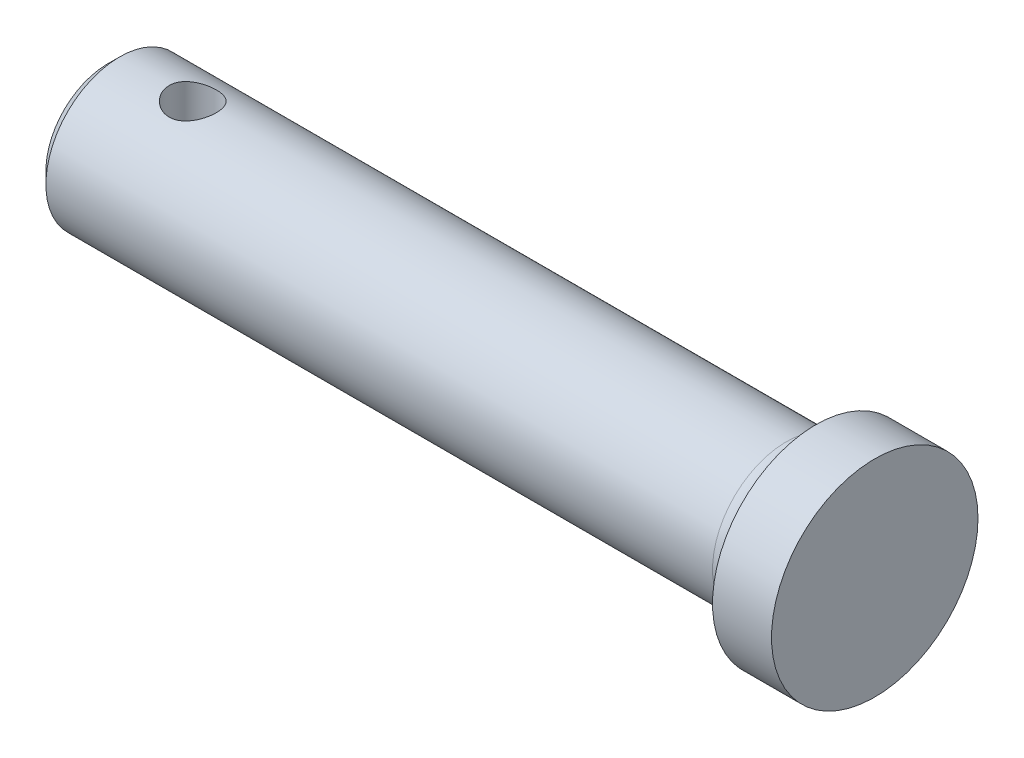
ISO-10303-21;
HEADER;
FILE_DESCRIPTION(('STEP AP214'),'2;1');
FILE_NAME('part.step','',(''),(''),'','','');
FILE_SCHEMA(('AUTOMOTIVE_DESIGN { 1 0 10303 214 1 1 1 1 }'));
ENDSEC;
DATA;
#1=APPLICATION_CONTEXT('core data for automotive mechanical design processes');
#2=APPLICATION_PROTOCOL_DEFINITION('international standard','automotive_design',2000,#1);
#3=PRODUCT_CONTEXT('',#1,'mechanical');
#4=PRODUCT('Part','Part','',(#3));
#5=PRODUCT_RELATED_PRODUCT_CATEGORY('part','',(#4));
#6=PRODUCT_DEFINITION_FORMATION('','',#4);
#7=PRODUCT_DEFINITION_CONTEXT('part definition',#1,'design');
#8=PRODUCT_DEFINITION('design','',#6,#7);
#9=PRODUCT_DEFINITION_SHAPE('','',#8);
#10=(LENGTH_UNIT() NAMED_UNIT(*) SI_UNIT(.MILLI.,.METRE.));
#11=(NAMED_UNIT(*) PLANE_ANGLE_UNIT() SI_UNIT($,.RADIAN.));
#12=(NAMED_UNIT(*) SI_UNIT($,.STERADIAN.) SOLID_ANGLE_UNIT());
#13=UNCERTAINTY_MEASURE_WITH_UNIT(LENGTH_MEASURE(1.E-05),#10,'distance_accuracy_value','');
#14=(GEOMETRIC_REPRESENTATION_CONTEXT(3) GLOBAL_UNCERTAINTY_ASSIGNED_CONTEXT((#13)) GLOBAL_UNIT_ASSIGNED_CONTEXT((#10,
#11,#12)) REPRESENTATION_CONTEXT('',''));
#15=CARTESIAN_POINT('',(0.,0.,0.));
#16=DIRECTION('',(0.,0.,1.));
#17=DIRECTION('',(1.,0.,0.));
#18=AXIS2_PLACEMENT_3D('',#15,#16,#17);
#19=CARTESIAN_POINT('',(12.,0.,0.));
#20=DIRECTION('',(-1.,0.,0.));
#21=DIRECTION('',(0.,0.,1.));
#22=AXIS2_PLACEMENT_3D('',#19,#20,#21);
#23=CYLINDRICAL_SURFACE('',#22,1.25);
#24=CARTESIAN_POINT('',(0.199999999999999,0.,0.));
#25=DIRECTION('',(1.,0.,0.));
#26=DIRECTION('',(0.,0.,-1.));
#27=AXIS2_PLACEMENT_3D('',#24,#25,#26);
#28=CIRCLE('',#27,1.25);
#29=CARTESIAN_POINT('',(0.199999999999999,0.,-1.25));
#30=VERTEX_POINT('',#29);
#31=EDGE_CURVE('E44',#30,#30,#28,.T.);
#32=ORIENTED_EDGE('',*,*,#31,.T.);
#33=EDGE_LOOP('',(#32));
#34=FACE_BOUND('',#33,.T.);
#35=CARTESIAN_POINT('',(1.44,-1.1842719282327,0.400000000000002));
#36=CARTESIAN_POINT('',(1.46184155948885,-1.18427199705065,0.399999935935952));
#37=CARTESIAN_POINT('',(1.48368387591803,-1.18488277435335,0.398204982921457));
#38=CARTESIAN_POINT('',(1.52672489688686,-1.18724843012857,0.391094422936348));
#39=CARTESIAN_POINT('',(1.54792345091376,-1.18900357403315,0.385777999167627));
#40=CARTESIAN_POINT('',(1.58904702541662,-1.19343925355512,0.37182755470459));
#41=CARTESIAN_POINT('',(1.60897430632724,-1.1961180891577,0.36319962541681));
#42=CARTESIAN_POINT('',(1.64710441025378,-1.20209691390213,0.342891586136491));
#43=CARTESIAN_POINT('',(1.6653069000917,-1.2053970226891,0.331210888071483));
#44=CARTESIAN_POINT('',(1.70012659878342,-1.21237992190423,0.304678104882738));
#45=CARTESIAN_POINT('',(1.71667254136882,-1.21607169507431,0.289734836823264));
#46=CARTESIAN_POINT('',(1.74707160646584,-1.22334570053617,0.25729603058258));
#47=CARTESIAN_POINT('',(1.76092433365551,-1.22692791668176,0.239800118371838));
#48=CARTESIAN_POINT('',(1.78586134632503,-1.23368238271334,0.202237355615685));
#49=CARTESIAN_POINT('',(1.79687178732732,-1.23684282786163,0.182119171965247));
#50=CARTESIAN_POINT('',(1.8153246409914,-1.24229242661382,0.140198048377141));
#51=CARTESIAN_POINT('',(1.82276793544067,-1.24458179551617,0.118395526351673));
#52=CARTESIAN_POINT('',(1.83363594480709,-1.24796769503786,0.0744711775297697));
#53=CARTESIAN_POINT('',(1.8371825644154,-1.24910032748544,0.052382347218549));
#54=CARTESIAN_POINT('',(1.84054327637528,-1.25017287029849,0.00789603248012458));
#55=CARTESIAN_POINT('',(1.84035825720045,-1.25011306457407,-0.0145013772077105));
#56=CARTESIAN_POINT('',(1.83634012450691,-1.24883236997898,-0.0581093729167385));
#57=CARTESIAN_POINT('',(1.83263925053984,-1.24765357034492,-0.0793335790758808));
#58=CARTESIAN_POINT('',(1.82191204418971,-1.24431948493381,-0.120842073412406));
#59=CARTESIAN_POINT('',(1.81488549158602,-1.24216413449167,-0.141126299248263));
#60=CARTESIAN_POINT('',(1.79762419187054,-1.23706365500521,-0.18047848740372));
#61=CARTESIAN_POINT('',(1.78735020460161,-1.23410893332627,-0.199527942968374));
#62=CARTESIAN_POINT('',(1.76391744827536,-1.22771970855094,-0.235672859352784));
#63=CARTESIAN_POINT('',(1.75075792313235,-1.22428507979218,-0.252767806251125));
#64=CARTESIAN_POINT('',(1.7212530895667,-1.2171236729529,-0.285306381310878));
#65=CARTESIAN_POINT('',(1.70479390923559,-1.21339068620886,-0.300645534450353));
#66=CARTESIAN_POINT('',(1.66950293475513,-1.20618145987784,-0.328378018395144));
#67=CARTESIAN_POINT('',(1.65067083261125,-1.20270525371291,-0.340770966192465));
#68=CARTESIAN_POINT('',(1.61086081492657,-1.19637089346056,-0.362388810956359));
#69=CARTESIAN_POINT('',(1.58985948115577,-1.19352081463549,-0.371573126098638));
#70=CARTESIAN_POINT('',(1.54649479840236,-1.18885562868785,-0.386241154381988));
#71=CARTESIAN_POINT('',(1.52413197070376,-1.1870401281737,-0.391726274263441));
#72=CARTESIAN_POINT('',(1.4796840224799,-1.1847375795604,-0.398634732977718));
#73=CARTESIAN_POINT('',(1.45762658792155,-1.18419801132839,-0.40021876938558));
#74=CARTESIAN_POINT('',(1.41355893236589,-1.18436224738472,-0.399732669767853));
#75=CARTESIAN_POINT('',(1.39154870422493,-1.18506584796445,-0.39766313242562));
#76=CARTESIAN_POINT('',(1.34890574316186,-1.18758511024498,-0.390072533361582));
#77=CARTESIAN_POINT('',(1.32825146332475,-1.18936586120205,-0.384659716428387));
#78=CARTESIAN_POINT('',(1.28814721006557,-1.19380128773476,-0.370664280725205));
#79=CARTESIAN_POINT('',(1.26869743990753,-1.1964561103373,-0.362081128645974));
#80=CARTESIAN_POINT('',(1.23091303820939,-1.20243860590778,-0.341697396012559));
#81=CARTESIAN_POINT('',(1.21262886029763,-1.20578396098416,-0.329808617389166));
#82=CARTESIAN_POINT('',(1.17825664445409,-1.2127347983344,-0.303252999413203));
#83=CARTESIAN_POINT('',(1.16216920649793,-1.21634035126439,-0.288585403708637));
#84=CARTESIAN_POINT('',(1.13192022234144,-1.22359628130632,-0.256125244512293));
#85=CARTESIAN_POINT('',(1.11787379960407,-1.22724171226698,-0.238223997872509));
#86=CARTESIAN_POINT('',(1.09297873068082,-1.23400966382322,-0.200229721221567));
#87=CARTESIAN_POINT('',(1.08212994796963,-1.23713220674139,-0.180136784836228));
#88=CARTESIAN_POINT('',(1.06404100068307,-1.24248572290487,-0.138445940226064));
#89=CARTESIAN_POINT('',(1.05677547039656,-1.24472294035215,-0.116859881389166));
#90=CARTESIAN_POINT('',(1.04600397397232,-1.24808106165771,-0.0726874957062997));
#91=CARTESIAN_POINT('',(1.04249676816827,-1.24920233359687,-0.0501015012458257));
#92=CARTESIAN_POINT('',(1.03944607302506,-1.25017663129826,-0.00562765879062506));
#93=CARTESIAN_POINT('',(1.03973667124253,-1.25008274477245,0.016247776123611));
#94=CARTESIAN_POINT('',(1.04386927119456,-1.24876568899275,0.0596238594775709));
#95=CARTESIAN_POINT('',(1.04771102195009,-1.2475425995457,0.081124534294193));
#96=CARTESIAN_POINT('',(1.05872956769149,-1.24412233539437,0.122850760398066));
#97=CARTESIAN_POINT('',(1.06586009311142,-1.24193869374862,0.143089717143293));
#98=CARTESIAN_POINT('',(1.08321165239307,-1.23682230993072,0.182093134276042));
#99=CARTESIAN_POINT('',(1.09343322795864,-1.23388943647033,0.200857335487156));
#100=CARTESIAN_POINT('',(1.11709027694636,-1.22745138549402,0.237094464163672));
#101=CARTESIAN_POINT('',(1.13062580905115,-1.22392975634581,0.254499113183194));
#102=CARTESIAN_POINT('',(1.16035231896004,-1.21675595998011,0.286844801950647));
#103=CARTESIAN_POINT('',(1.17654410992333,-1.21310375305752,0.301785084465705));
#104=CARTESIAN_POINT('',(1.21180666140923,-1.20592883124558,0.329310491309836));
#105=CARTESIAN_POINT('',(1.23095875051859,-1.20241521108021,0.341794102245843));
#106=CARTESIAN_POINT('',(1.27119617641749,-1.19607741955207,0.363353471704927));
#107=CARTESIAN_POINT('',(1.29228082275794,-1.19325300326645,0.372430441467136));
#108=CARTESIAN_POINT('',(1.33424571027844,-1.18881467077541,0.386354015966545));
#109=CARTESIAN_POINT('',(1.35503378897818,-1.18712893466933,0.391455627648995));
#110=CARTESIAN_POINT('',(1.39721444971404,-1.18485768284986,0.398278180436229));
#111=CARTESIAN_POINT('',(1.4186068617678,-1.18427186082763,0.400000062748775));
#112=CARTESIAN_POINT('',(1.44,-1.1842719282327,0.400000000000002));
#113=B_SPLINE_CURVE_WITH_KNOTS('',3,(#35,#36,#37,#38,#39,#40,#41,#42,#43,#44,#45,#46,#47,#48,
#49,#50,#51,#52,#53,#54,#55,#56,#57,#58,#59,#60,#61,#62,#63,#64,#65,#66,#67,#68,#69,#70,#71,#72,
#73,#74,#75,#76,#77,#78,#79,#80,#81,#82,#83,#84,#85,#86,#87,#88,#89,#90,#91,#92,#93,#94,#95,#96,
#97,#98,#99,#100,#101,#102,#103,#104,#105,#106,#107,#108,#109,#110,#111,#112),.UNSPECIFIED.,.T.,
.F.,(4,2,2,2,2,2,2,2,2,2,2,2,2,2,2,2,2,2,2,2,2,2,2,2,2,2,2,2,2,2,2,2,2,2,2,2,2,2,4),(0.,
0.0654455842618314,0.130906353814331,0.196247283079579,0.26160080863461,0.329090543023647,
0.396590176384582,0.465698443708911,0.534789618862443,0.601651686030156,0.668497834057723,
0.732925318488274,0.797357069791251,0.862599225170845,0.92785849615777,0.995962670791873,
1.06407569416318,1.13302140452565,1.20194088121282,1.26796997830033,1.33398825670589,
1.39797364081714,1.46196979336382,1.52787163318736,1.59379143633313,1.66259668092843,
1.73139898741332,1.79970699217212,1.86799245890297,1.93330513200712,1.99861318946651,
2.06302921464941,2.12745653523327,2.19414122838632,2.26084637391653,2.32990150248183,
2.39893205502387,2.46305185838162,2.52715380272838),.UNSPECIFIED.);
#114=CARTESIAN_POINT('',(1.44,-1.1842719282327,0.400000000000002));
#115=VERTEX_POINT('',#114);
#116=EDGE_CURVE('E57',#115,#115,#113,.T.);
#117=ORIENTED_EDGE('',*,*,#116,.T.);
#118=EDGE_LOOP('',(#117));
#119=FACE_BOUND('',#118,.T.);
#120=CARTESIAN_POINT('',(1.44,1.1842719282327,0.400000000000002));
#121=CARTESIAN_POINT('',(1.41815844051115,1.18427199705065,0.399999935935952));
#122=CARTESIAN_POINT('',(1.39631612408197,1.18488277435335,0.398204982921457));
#123=CARTESIAN_POINT('',(1.35327510311314,1.18724843012857,0.391094422936348));
#124=CARTESIAN_POINT('',(1.33207654908623,1.18900357403315,0.385777999167627));
#125=CARTESIAN_POINT('',(1.29095297458338,1.19343925355512,0.37182755470459));
#126=CARTESIAN_POINT('',(1.27102569367276,1.1961180891577,0.36319962541681));
#127=CARTESIAN_POINT('',(1.23289558974622,1.20209691390213,0.342891586136491));
#128=CARTESIAN_POINT('',(1.2146930999083,1.2053970226891,0.331210888071483));
#129=CARTESIAN_POINT('',(1.17987340121658,1.21237992190423,0.304678104882738));
#130=CARTESIAN_POINT('',(1.16332745863118,1.21607169507431,0.289734836823264));
#131=CARTESIAN_POINT('',(1.13292839353416,1.22334570053617,0.25729603058258));
#132=CARTESIAN_POINT('',(1.11907566634449,1.22692791668176,0.239800118371838));
#133=CARTESIAN_POINT('',(1.09413865367496,1.23368238271334,0.202237355615685));
#134=CARTESIAN_POINT('',(1.08312821267268,1.23684282786163,0.182119171965247));
#135=CARTESIAN_POINT('',(1.0646753590086,1.24229242661382,0.140198048377141));
#136=CARTESIAN_POINT('',(1.05723206455933,1.24458179551617,0.118395526351673));
#137=CARTESIAN_POINT('',(1.04636405519291,1.24796769503786,0.0744711775297697));
#138=CARTESIAN_POINT('',(1.0428174355846,1.24910032748544,0.052382347218549));
#139=CARTESIAN_POINT('',(1.03945672362472,1.25017287029849,0.00789603248012461));
#140=CARTESIAN_POINT('',(1.03964174279955,1.25011306457407,-0.0145013772077105));
#141=CARTESIAN_POINT('',(1.04365987549309,1.24883236997898,-0.0581093729167385));
#142=CARTESIAN_POINT('',(1.04736074946015,1.24765357034492,-0.0793335790758808));
#143=CARTESIAN_POINT('',(1.05808795581029,1.24431948493381,-0.120842073412406));
#144=CARTESIAN_POINT('',(1.06511450841398,1.24216413449167,-0.141126299248263));
#145=CARTESIAN_POINT('',(1.08237580812945,1.23706365500521,-0.18047848740372));
#146=CARTESIAN_POINT('',(1.09264979539839,1.23410893332627,-0.199527942968374));
#147=CARTESIAN_POINT('',(1.11608255172464,1.22771970855094,-0.235672859352784));
#148=CARTESIAN_POINT('',(1.12924207686765,1.22428507979218,-0.252767806251125));
#149=CARTESIAN_POINT('',(1.1587469104333,1.2171236729529,-0.285306381310878));
#150=CARTESIAN_POINT('',(1.17520609076441,1.21339068620886,-0.300645534450353));
#151=CARTESIAN_POINT('',(1.21049706524487,1.20618145987784,-0.328378018395144));
#152=CARTESIAN_POINT('',(1.22932916738875,1.20270525371291,-0.340770966192465));
#153=CARTESIAN_POINT('',(1.26913918507343,1.19637089346056,-0.362388810956359));
#154=CARTESIAN_POINT('',(1.29014051884423,1.19352081463549,-0.371573126098638));
#155=CARTESIAN_POINT('',(1.33350520159764,1.18885562868785,-0.386241154381988));
#156=CARTESIAN_POINT('',(1.35586802929623,1.1870401281737,-0.391726274263441));
#157=CARTESIAN_POINT('',(1.4003159775201,1.1847375795604,-0.398634732977718));
#158=CARTESIAN_POINT('',(1.42237341207845,1.18419801132839,-0.40021876938558));
#159=CARTESIAN_POINT('',(1.46644106763411,1.18436224738472,-0.399732669767853));
#160=CARTESIAN_POINT('',(1.48845129577507,1.18506584796445,-0.39766313242562));
#161=CARTESIAN_POINT('',(1.53109425683814,1.18758511024498,-0.390072533361582));
#162=CARTESIAN_POINT('',(1.55174853667525,1.18936586120205,-0.384659716428387));
#163=CARTESIAN_POINT('',(1.59185278993443,1.19380128773476,-0.370664280725205));
#164=CARTESIAN_POINT('',(1.61130256009247,1.1964561103373,-0.362081128645974));
#165=CARTESIAN_POINT('',(1.6490869617906,1.20243860590778,-0.341697396012559));
#166=CARTESIAN_POINT('',(1.66737113970237,1.20578396098416,-0.329808617389166));
#167=CARTESIAN_POINT('',(1.7017433555459,1.2127347983344,-0.303252999413203));
#168=CARTESIAN_POINT('',(1.71783079350207,1.21634035126439,-0.288585403708637));
#169=CARTESIAN_POINT('',(1.74807977765856,1.22359628130632,-0.256125244512293));
#170=CARTESIAN_POINT('',(1.76212620039593,1.22724171226698,-0.238223997872509));
#171=CARTESIAN_POINT('',(1.78702126931918,1.23400966382322,-0.200229721221567));
#172=CARTESIAN_POINT('',(1.79787005203037,1.23713220674139,-0.180136784836228));
#173=CARTESIAN_POINT('',(1.81595899931693,1.24248572290487,-0.138445940226064));
#174=CARTESIAN_POINT('',(1.82322452960344,1.24472294035215,-0.116859881389166));
#175=CARTESIAN_POINT('',(1.83399602602768,1.24808106165771,-0.0726874957062997));
#176=CARTESIAN_POINT('',(1.83750323183173,1.24920233359687,-0.0501015012458257));
#177=CARTESIAN_POINT('',(1.84055392697494,1.25017663129826,-0.00562765879062506));
#178=CARTESIAN_POINT('',(1.84026332875747,1.25008274477245,0.016247776123611));
#179=CARTESIAN_POINT('',(1.83613072880544,1.24876568899275,0.0596238594775709));
#180=CARTESIAN_POINT('',(1.83228897804991,1.2475425995457,0.081124534294193));
#181=CARTESIAN_POINT('',(1.82127043230851,1.24412233539437,0.122850760398066));
#182=CARTESIAN_POINT('',(1.81413990688858,1.24193869374862,0.143089717143293));
#183=CARTESIAN_POINT('',(1.79678834760693,1.23682230993072,0.182093134276042));
#184=CARTESIAN_POINT('',(1.78656677204136,1.23388943647033,0.200857335487156));
#185=CARTESIAN_POINT('',(1.76290972305363,1.22745138549402,0.237094464163672));
#186=CARTESIAN_POINT('',(1.74937419094885,1.22392975634581,0.254499113183194));
#187=CARTESIAN_POINT('',(1.71964768103996,1.21675595998011,0.286844801950647));
#188=CARTESIAN_POINT('',(1.70345589007666,1.21310375305752,0.301785084465705));
#189=CARTESIAN_POINT('',(1.66819333859077,1.20592883124558,0.329310491309836));
#190=CARTESIAN_POINT('',(1.64904124948141,1.20241521108021,0.341794102245843));
#191=CARTESIAN_POINT('',(1.60880382358251,1.19607741955207,0.363353471704927));
#192=CARTESIAN_POINT('',(1.58771917724206,1.19325300326645,0.372430441467136));
#193=CARTESIAN_POINT('',(1.54575428972156,1.18881467077541,0.386354015966545));
#194=CARTESIAN_POINT('',(1.52496621102182,1.18712893466933,0.391455627648995));
#195=CARTESIAN_POINT('',(1.48278555028596,1.18485768284986,0.398278180436229));
#196=CARTESIAN_POINT('',(1.4613931382322,1.18427186082763,0.400000062748775));
#197=CARTESIAN_POINT('',(1.44,1.1842719282327,0.400000000000002));
#198=B_SPLINE_CURVE_WITH_KNOTS('',3,(#120,#121,#122,#123,#124,#125,#126,#127,#128,#129,#130,
#131,#132,#133,#134,#135,#136,#137,#138,#139,#140,#141,#142,#143,#144,#145,#146,#147,#148,#149,
#150,#151,#152,#153,#154,#155,#156,#157,#158,#159,#160,#161,#162,#163,#164,#165,#166,#167,#168,
#169,#170,#171,#172,#173,#174,#175,#176,#177,#178,#179,#180,#181,#182,#183,#184,#185,#186,#187,
#188,#189,#190,#191,#192,#193,#194,#195,#196,#197),.UNSPECIFIED.,.T.,.F.,(4,2,2,2,2,2,2,2,2,2,2,
2,2,2,2,2,2,2,2,2,2,2,2,2,2,2,2,2,2,2,2,2,2,2,2,2,2,2,4),(0.,0.0654455842618314,
0.130906353814331,0.196247283079579,0.26160080863461,0.329090543023647,0.396590176384582,
0.465698443708911,0.534789618862443,0.601651686030156,0.668497834057723,0.732925318488274,
0.797357069791251,0.862599225170845,0.92785849615777,0.995962670791873,1.06407569416318,
1.13302140452565,1.20194088121282,1.26796997830033,1.33398825670589,1.39797364081714,
1.46196979336382,1.52787163318736,1.59379143633313,1.66259668092843,1.73139898741332,
1.79970699217212,1.86799245890297,1.93330513200712,1.99861318946651,2.06302921464941,
2.12745653523327,2.19414122838632,2.26084637391653,2.32990150248183,2.39893205502387,
2.46305185838162,2.52715380272838),.UNSPECIFIED.);
#199=CARTESIAN_POINT('',(1.44,1.1842719282327,0.400000000000002));
#200=VERTEX_POINT('',#199);
#201=EDGE_CURVE('E67',#200,#200,#198,.T.);
#202=ORIENTED_EDGE('',*,*,#201,.T.);
#203=EDGE_LOOP('',(#202));
#204=FACE_BOUND('',#203,.T.);
#205=CARTESIAN_POINT('',(11.5,0.,0.));
#206=DIRECTION('',(1.,0.,0.));
#207=DIRECTION('',(0.,0.,-1.));
#208=AXIS2_PLACEMENT_3D('',#205,#206,#207);
#209=CIRCLE('',#208,1.25);
#210=CARTESIAN_POINT('',(11.5,0.,-1.25));
#211=VERTEX_POINT('',#210);
#212=EDGE_CURVE('E49',#211,#211,#209,.F.);
#213=ORIENTED_EDGE('',*,*,#212,.T.);
#214=EDGE_LOOP('',(#213));
#215=FACE_BOUND('',#214,.T.);
#216=ADVANCED_FACE('F36',(#34,#119,#204,#215),#23,.T.);
#217=CARTESIAN_POINT('',(0.,0.,0.));
#218=DIRECTION('',(1.,0.,0.));
#219=DIRECTION('',(0.,0.,-1.));
#220=AXIS2_PLACEMENT_3D('',#217,#218,#219);
#221=PLANE('',#220);
#222=CARTESIAN_POINT('',(0.,0.,0.));
#223=DIRECTION('',(1.,0.,0.));
#224=DIRECTION('',(0.,0.,-1.));
#225=AXIS2_PLACEMENT_3D('',#222,#223,#224);
#226=CIRCLE('',#225,1.05);
#227=CARTESIAN_POINT('',(0.,0.,-1.05));
#228=VERTEX_POINT('',#227);
#229=EDGE_CURVE('E10',#228,#228,#226,.F.);
#230=ORIENTED_EDGE('',*,*,#229,.T.);
#231=EDGE_LOOP('',(#230));
#232=FACE_BOUND('',#231,.T.);
#233=ADVANCED_FACE('F86',(#232),#221,.F.);
#234=CARTESIAN_POINT('',(13.,0.,0.));
#235=DIRECTION('',(-1.,0.,0.));
#236=DIRECTION('',(0.,0.,1.));
#237=AXIS2_PLACEMENT_3D('',#234,#235,#236);
#238=CYLINDRICAL_SURFACE('',#237,1.75);
#239=CARTESIAN_POINT('',(13.,0.,0.));
#240=DIRECTION('',(1.,0.,0.));
#241=DIRECTION('',(0.,0.,-1.));
#242=AXIS2_PLACEMENT_3D('',#239,#240,#241);
#243=CIRCLE('',#242,1.75);
#244=CARTESIAN_POINT('',(13.,0.,-1.75));
#245=VERTEX_POINT('',#244);
#246=EDGE_CURVE('E54',#245,#245,#243,.T.);
#247=ORIENTED_EDGE('',*,*,#246,.F.);
#248=EDGE_LOOP('',(#247));
#249=FACE_BOUND('',#248,.T.);
#250=CARTESIAN_POINT('',(12.,0.,0.));
#251=DIRECTION('',(1.,0.,0.));
#252=DIRECTION('',(0.,0.,-1.));
#253=AXIS2_PLACEMENT_3D('',#250,#251,#252);
#254=CIRCLE('',#253,1.75);
#255=CARTESIAN_POINT('',(12.,0.,-1.75));
#256=VERTEX_POINT('',#255);
#257=EDGE_CURVE('E66',#256,#256,#254,.T.);
#258=ORIENTED_EDGE('',*,*,#257,.T.);
#259=EDGE_LOOP('',(#258));
#260=FACE_BOUND('',#259,.T.);
#261=ADVANCED_FACE('F83',(#249,#260),#238,.T.);
#262=CARTESIAN_POINT('',(13.,0.,0.));
#263=DIRECTION('',(1.,0.,0.));
#264=DIRECTION('',(0.,0.,-1.));
#265=AXIS2_PLACEMENT_3D('',#262,#263,#264);
#266=PLANE('',#265);
#267=ORIENTED_EDGE('',*,*,#246,.T.);
#268=EDGE_LOOP('',(#267));
#269=FACE_BOUND('',#268,.T.);
#270=ADVANCED_FACE('F79',(#269),#266,.T.);
#271=CARTESIAN_POINT('',(11.5,0.,0.));
#272=DIRECTION('',(1.,0.,0.));
#273=DIRECTION('',(0.,0.,-1.));
#274=AXIS2_PLACEMENT_3D('',#271,#272,#273);
#275=TOROIDAL_SURFACE('',#274,1.75,0.5);
#276=ORIENTED_EDGE('',*,*,#212,.F.);
#277=EDGE_LOOP('',(#276));
#278=FACE_BOUND('',#277,.T.);
#279=ORIENTED_EDGE('',*,*,#257,.F.);
#280=EDGE_LOOP('',(#279));
#281=FACE_BOUND('',#280,.T.);
#282=ADVANCED_FACE('F77',(#278,#281),#275,.F.);
#283=CARTESIAN_POINT('',(1.44,-1.75,0.));
#284=DIRECTION('',(0.,1.,0.));
#285=DIRECTION('',(0.,0.,1.));
#286=AXIS2_PLACEMENT_3D('',#283,#284,#285);
#287=CYLINDRICAL_SURFACE('',#286,0.4);
#288=ORIENTED_EDGE('',*,*,#201,.F.);
#289=EDGE_LOOP('',(#288));
#290=FACE_BOUND('',#289,.T.);
#291=ORIENTED_EDGE('',*,*,#116,.F.);
#292=EDGE_LOOP('',(#291));
#293=FACE_BOUND('',#292,.T.);
#294=ADVANCED_FACE('F73',(#290,#293),#287,.F.);
#295=CARTESIAN_POINT('',(0.199999999999999,0.,0.));
#296=DIRECTION('',(1.,0.,0.));
#297=DIRECTION('',(0.,0.,-1.));
#298=AXIS2_PLACEMENT_3D('',#295,#296,#297);
#299=CONICAL_SURFACE('',#298,1.25,0.785398163397446);
#300=ORIENTED_EDGE('',*,*,#229,.F.);
#301=EDGE_LOOP('',(#300));
#302=FACE_BOUND('',#301,.T.);
#303=ORIENTED_EDGE('',*,*,#31,.F.);
#304=EDGE_LOOP('',(#303));
#305=FACE_BOUND('',#304,.T.);
#306=ADVANCED_FACE('F38',(#302,#305),#299,.T.);
#307=CLOSED_SHELL('',(#216,#233,#261,#270,#282,#294,#306));
#308=MANIFOLD_SOLID_BREP('B2',#307);
#309=ADVANCED_BREP_SHAPE_REPRESENTATION('',(#18,#308),#14);
#310=SHAPE_DEFINITION_REPRESENTATION(#9,#309);
ENDSEC;
END-ISO-10303-21;
